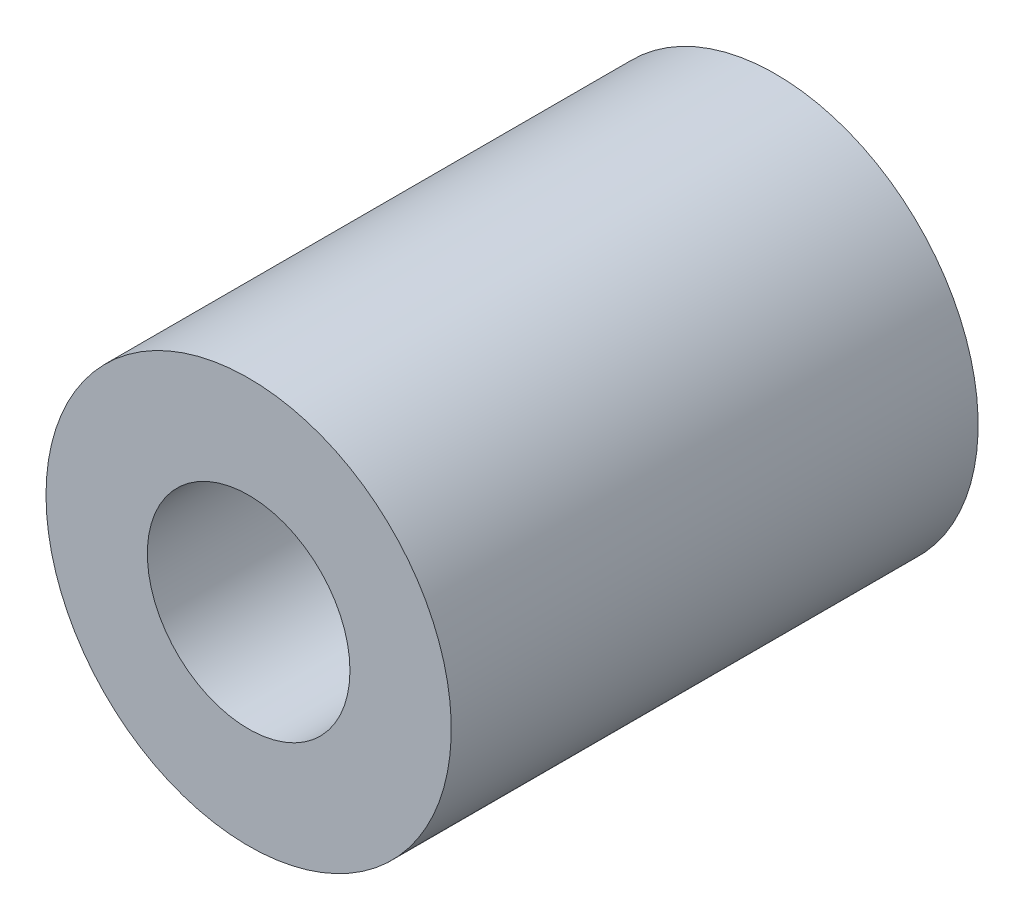
ISO-10303-21;
HEADER;
FILE_DESCRIPTION(('STEP AP214'),'2;1');
FILE_NAME('part.step','',(''),(''),'','','');
FILE_SCHEMA(('AUTOMOTIVE_DESIGN { 1 0 10303 214 1 1 1 1 }'));
ENDSEC;
DATA;
#1=APPLICATION_CONTEXT('core data for automotive mechanical design processes');
#2=APPLICATION_PROTOCOL_DEFINITION('international standard','automotive_design',2000,#1);
#3=PRODUCT_CONTEXT('',#1,'mechanical');
#4=PRODUCT('Part','Part','',(#3));
#5=PRODUCT_RELATED_PRODUCT_CATEGORY('part','',(#4));
#6=PRODUCT_DEFINITION_FORMATION('','',#4);
#7=PRODUCT_DEFINITION_CONTEXT('part definition',#1,'design');
#8=PRODUCT_DEFINITION('design','',#6,#7);
#9=PRODUCT_DEFINITION_SHAPE('','',#8);
#10=(LENGTH_UNIT() NAMED_UNIT(*) SI_UNIT(.MILLI.,.METRE.));
#11=(NAMED_UNIT(*) PLANE_ANGLE_UNIT() SI_UNIT($,.RADIAN.));
#12=(NAMED_UNIT(*) SI_UNIT($,.STERADIAN.) SOLID_ANGLE_UNIT());
#13=UNCERTAINTY_MEASURE_WITH_UNIT(LENGTH_MEASURE(1.E-05),#10,'distance_accuracy_value','');
#14=(GEOMETRIC_REPRESENTATION_CONTEXT(3) GLOBAL_UNCERTAINTY_ASSIGNED_CONTEXT((#13)) GLOBAL_UNIT_ASSIGNED_CONTEXT((#10,
#11,#12)) REPRESENTATION_CONTEXT('',''));
#15=CARTESIAN_POINT('',(0.,0.,0.));
#16=DIRECTION('',(0.,0.,1.));
#17=DIRECTION('',(1.,0.,0.));
#18=AXIS2_PLACEMENT_3D('',#15,#16,#17);
#19=CARTESIAN_POINT('',(0.,0.,26.));
#20=DIRECTION('',(0.,0.,-1.));
#21=DIRECTION('',(-1.,0.,0.));
#22=AXIS2_PLACEMENT_3D('',#19,#20,#21);
#23=CYLINDRICAL_SURFACE('',#22,10.);
#24=CARTESIAN_POINT('',(0.,0.,26.));
#25=DIRECTION('',(0.,0.,1.));
#26=DIRECTION('',(1.,0.,0.));
#27=AXIS2_PLACEMENT_3D('',#24,#25,#26);
#28=CIRCLE('',#27,10.);
#29=CARTESIAN_POINT('',(-10.,0.,26.));
#30=VERTEX_POINT('',#29);
#31=EDGE_CURVE('E10',#30,#30,#28,.T.);
#32=CARTESIAN_POINT('',(0.,0.,0.));
#33=DIRECTION('',(0.,0.,1.));
#34=DIRECTION('',(1.,0.,0.));
#35=AXIS2_PLACEMENT_3D('',#32,#33,#34);
#36=CIRCLE('',#35,10.);
#37=CARTESIAN_POINT('',(-10.,0.,0.));
#38=VERTEX_POINT('',#37);
#39=EDGE_CURVE('E34',#38,#38,#36,.T.);
#40=CARTESIAN_POINT('',(-10.,0.,26.));
#41=CARTESIAN_POINT('',(-10.,0.,25.7291666666667));
#42=CARTESIAN_POINT('',(-10.,0.,25.4583333333333));
#43=CARTESIAN_POINT('',(-10.,0.,24.9166666666667));
#44=CARTESIAN_POINT('',(-10.,0.,24.6458333333333));
#45=CARTESIAN_POINT('',(-10.,0.,24.1041666666667));
#46=CARTESIAN_POINT('',(-10.,0.,23.8333333333333));
#47=CARTESIAN_POINT('',(-10.,0.,23.2916666666667));
#48=CARTESIAN_POINT('',(-10.,0.,23.0208333333333));
#49=CARTESIAN_POINT('',(-10.,0.,22.4791666666667));
#50=CARTESIAN_POINT('',(-10.,0.,22.2083333333333));
#51=CARTESIAN_POINT('',(-10.,0.,21.6666666666667));
#52=CARTESIAN_POINT('',(-10.,0.,21.3958333333333));
#53=CARTESIAN_POINT('',(-10.,0.,20.8541666666667));
#54=CARTESIAN_POINT('',(-10.,0.,20.5833333333333));
#55=CARTESIAN_POINT('',(-10.,0.,20.0416666666667));
#56=CARTESIAN_POINT('',(-10.,0.,19.7708333333333));
#57=CARTESIAN_POINT('',(-10.,0.,19.2291666666667));
#58=CARTESIAN_POINT('',(-10.,0.,18.9583333333333));
#59=CARTESIAN_POINT('',(-10.,0.,18.4166666666667));
#60=CARTESIAN_POINT('',(-10.,0.,18.1458333333333));
#61=CARTESIAN_POINT('',(-10.,0.,17.6041666666667));
#62=CARTESIAN_POINT('',(-10.,0.,17.3333333333333));
#63=CARTESIAN_POINT('',(-10.,0.,16.7916666666667));
#64=CARTESIAN_POINT('',(-10.,0.,16.5208333333333));
#65=CARTESIAN_POINT('',(-10.,0.,15.9791666666667));
#66=CARTESIAN_POINT('',(-10.,0.,15.7083333333333));
#67=CARTESIAN_POINT('',(-10.,0.,15.1666666666667));
#68=CARTESIAN_POINT('',(-10.,0.,14.8958333333333));
#69=CARTESIAN_POINT('',(-10.,0.,14.3541666666667));
#70=CARTESIAN_POINT('',(-10.,0.,14.0833333333333));
#71=CARTESIAN_POINT('',(-10.,0.,13.5416666666667));
#72=CARTESIAN_POINT('',(-10.,0.,13.2708333333333));
#73=CARTESIAN_POINT('',(-10.,0.,12.7291666666667));
#74=CARTESIAN_POINT('',(-10.,0.,12.4583333333333));
#75=CARTESIAN_POINT('',(-10.,0.,11.9166666666667));
#76=CARTESIAN_POINT('',(-10.,0.,11.6458333333333));
#77=CARTESIAN_POINT('',(-10.,0.,11.1041666666667));
#78=CARTESIAN_POINT('',(-10.,0.,10.8333333333333));
#79=CARTESIAN_POINT('',(-10.,0.,10.2916666666667));
#80=CARTESIAN_POINT('',(-10.,0.,10.0208333333333));
#81=CARTESIAN_POINT('',(-10.,0.,9.47916666666667));
#82=CARTESIAN_POINT('',(-10.,0.,9.20833333333333));
#83=CARTESIAN_POINT('',(-10.,0.,8.66666666666667));
#84=CARTESIAN_POINT('',(-10.,0.,8.39583333333333));
#85=CARTESIAN_POINT('',(-10.,0.,7.85416666666667));
#86=CARTESIAN_POINT('',(-10.,0.,7.58333333333333));
#87=CARTESIAN_POINT('',(-10.,0.,7.04166666666667));
#88=CARTESIAN_POINT('',(-10.,0.,6.77083333333333));
#89=CARTESIAN_POINT('',(-10.,0.,6.22916666666667));
#90=CARTESIAN_POINT('',(-10.,0.,5.95833333333333));
#91=CARTESIAN_POINT('',(-10.,0.,5.41666666666667));
#92=CARTESIAN_POINT('',(-10.,0.,5.14583333333333));
#93=CARTESIAN_POINT('',(-10.,0.,4.60416666666667));
#94=CARTESIAN_POINT('',(-10.,0.,4.33333333333333));
#95=CARTESIAN_POINT('',(-10.,0.,3.79166666666667));
#96=CARTESIAN_POINT('',(-10.,0.,3.52083333333333));
#97=CARTESIAN_POINT('',(-10.,0.,2.97916666666667));
#98=CARTESIAN_POINT('',(-10.,0.,2.70833333333333));
#99=CARTESIAN_POINT('',(-10.,0.,2.16666666666667));
#100=CARTESIAN_POINT('',(-10.,0.,1.89583333333333));
#101=CARTESIAN_POINT('',(-10.,0.,1.35416666666667));
#102=CARTESIAN_POINT('',(-10.,0.,1.08333333333333));
#103=CARTESIAN_POINT('',(-10.,0.,0.541666666666667));
#104=CARTESIAN_POINT('',(-10.,0.,0.270833333333334));
#105=CARTESIAN_POINT('',(-10.,0.,0.));
#106=B_SPLINE_CURVE_WITH_KNOTS('',3,(#40,#41,#42,#43,#44,#45,#46,#47,#48,#49,#50,#51,#52,#53,
#54,#55,#56,#57,#58,#59,#60,#61,#62,#63,#64,#65,#66,#67,#68,#69,#70,#71,#72,#73,#74,#75,#76,#77,
#78,#79,#80,#81,#82,#83,#84,#85,#86,#87,#88,#89,#90,#91,#92,#93,#94,#95,#96,#97,#98,#99,#100,
#101,#102,#103,#104,#105),.UNSPECIFIED.,.F.,.F.,(4,2,2,2,2,2,2,2,2,2,2,2,2,2,2,2,2,2,2,2,2,2,2,
2,2,2,2,2,2,2,2,2,4),(0.,0.812499999999997,1.625,2.4375,3.25,4.0625,4.875,5.6875,6.5,7.3125,
8.125,8.93749999999999,9.74999999999999,10.5625,11.375,12.1875,13.,13.8125,14.625,15.4375,16.25,
17.0625,17.875,18.6875,19.5,20.3125,21.125,21.9375,22.75,23.5625,24.375,25.1875,26.),.UNSPECIFIED.);
#107=EDGE_CURVE('BSEAM31',#30,#38,#106,.T.);
#108=ORIENTED_EDGE('',*,*,#31,.F.);
#109=ORIENTED_EDGE('',*,*,#39,.T.);
#110=ORIENTED_EDGE('',*,*,#107,.T.);
#111=ORIENTED_EDGE('',*,*,#107,.F.);
#112=EDGE_LOOP('',(#108,#110,#109,#111));
#113=FACE_BOUND('',#112,.T.);
#114=ADVANCED_FACE('F31',(#113),#23,.T.);
#115=CARTESIAN_POINT('',(0.,0.,26.));
#116=DIRECTION('',(0.,0.,1.));
#117=DIRECTION('',(1.,0.,0.));
#118=AXIS2_PLACEMENT_3D('',#115,#116,#117);
#119=PLANE('',#118);
#120=CARTESIAN_POINT('',(0.,0.,26.));
#121=DIRECTION('',(0.,0.,1.));
#122=DIRECTION('',(1.,0.,0.));
#123=AXIS2_PLACEMENT_3D('',#120,#121,#122);
#124=CIRCLE('',#123,5.);
#125=CARTESIAN_POINT('',(5.,0.,26.));
#126=VERTEX_POINT('',#125);
#127=EDGE_CURVE('E43',#126,#126,#124,.T.);
#128=ORIENTED_EDGE('',*,*,#127,.F.);
#129=EDGE_LOOP('',(#128));
#130=FACE_BOUND('',#129,.T.);
#131=ORIENTED_EDGE('',*,*,#31,.T.);
#132=EDGE_LOOP('',(#131));
#133=FACE_BOUND('',#132,.T.);
#134=ADVANCED_FACE('F68',(#130,#133),#119,.T.);
#135=CARTESIAN_POINT('',(0.,0.,0.));
#136=DIRECTION('',(0.,0.,1.));
#137=DIRECTION('',(1.,0.,0.));
#138=AXIS2_PLACEMENT_3D('',#135,#136,#137);
#139=PLANE('',#138);
#140=CARTESIAN_POINT('',(0.,0.,0.));
#141=DIRECTION('',(0.,0.,-1.));
#142=DIRECTION('',(-1.,0.,0.));
#143=AXIS2_PLACEMENT_3D('',#140,#141,#142);
#144=CIRCLE('',#143,2.);
#145=CARTESIAN_POINT('',(-2.,0.,0.));
#146=VERTEX_POINT('',#145);
#147=EDGE_CURVE('E49',#146,#146,#144,.T.);
#148=ORIENTED_EDGE('',*,*,#147,.F.);
#149=EDGE_LOOP('',(#148));
#150=FACE_BOUND('',#149,.T.);
#151=ORIENTED_EDGE('',*,*,#39,.F.);
#152=EDGE_LOOP('',(#151));
#153=FACE_BOUND('',#152,.T.);
#154=ADVANCED_FACE('F64',(#150,#153),#139,.F.);
#155=CARTESIAN_POINT('',(0.,0.,18.));
#156=DIRECTION('',(0.,0.,1.));
#157=DIRECTION('',(1.,0.,0.));
#158=AXIS2_PLACEMENT_3D('',#155,#156,#157);
#159=CYLINDRICAL_SURFACE('',#158,5.);
#160=CARTESIAN_POINT('',(0.,0.,18.));
#161=DIRECTION('',(0.,0.,1.));
#162=DIRECTION('',(1.,0.,0.));
#163=AXIS2_PLACEMENT_3D('',#160,#161,#162);
#164=CIRCLE('',#163,5.);
#165=CARTESIAN_POINT('',(5.,0.,18.));
#166=VERTEX_POINT('',#165);
#167=EDGE_CURVE('E41',#166,#166,#164,.T.);
#168=ORIENTED_EDGE('',*,*,#167,.F.);
#169=EDGE_LOOP('',(#168));
#170=FACE_BOUND('',#169,.T.);
#171=ORIENTED_EDGE('',*,*,#127,.T.);
#172=EDGE_LOOP('',(#171));
#173=FACE_BOUND('',#172,.T.);
#174=ADVANCED_FACE('F67',(#170,#173),#159,.F.);
#175=CARTESIAN_POINT('',(0.,0.,18.));
#176=DIRECTION('',(0.,0.,1.));
#177=DIRECTION('',(1.,0.,0.));
#178=AXIS2_PLACEMENT_3D('',#175,#176,#177);
#179=PLANE('',#178);
#180=ORIENTED_EDGE('',*,*,#167,.T.);
#181=EDGE_LOOP('',(#180));
#182=FACE_BOUND('',#181,.T.);
#183=ADVANCED_FACE('F60',(#182),#179,.T.);
#184=CARTESIAN_POINT('',(0.,0.,8.));
#185=DIRECTION('',(0.,0.,-1.));
#186=DIRECTION('',(-1.,0.,0.));
#187=AXIS2_PLACEMENT_3D('',#184,#185,#186);
#188=CYLINDRICAL_SURFACE('',#187,2.);
#189=CARTESIAN_POINT('',(0.,0.,8.));
#190=DIRECTION('',(0.,0.,-1.));
#191=DIRECTION('',(-1.,0.,0.));
#192=AXIS2_PLACEMENT_3D('',#189,#190,#191);
#193=CIRCLE('',#192,2.);
#194=CARTESIAN_POINT('',(-2.,0.,8.));
#195=VERTEX_POINT('',#194);
#196=EDGE_CURVE('E46',#195,#195,#193,.T.);
#197=ORIENTED_EDGE('',*,*,#196,.F.);
#198=EDGE_LOOP('',(#197));
#199=FACE_BOUND('',#198,.T.);
#200=ORIENTED_EDGE('',*,*,#147,.T.);
#201=EDGE_LOOP('',(#200));
#202=FACE_BOUND('',#201,.T.);
#203=ADVANCED_FACE('F57',(#199,#202),#188,.F.);
#204=CARTESIAN_POINT('',(0.,0.,8.));
#205=DIRECTION('',(0.,0.,-1.));
#206=DIRECTION('',(-1.,0.,0.));
#207=AXIS2_PLACEMENT_3D('',#204,#205,#206);
#208=PLANE('',#207);
#209=ORIENTED_EDGE('',*,*,#196,.T.);
#210=EDGE_LOOP('',(#209));
#211=FACE_BOUND('',#210,.T.);
#212=ADVANCED_FACE('F55',(#211),#208,.T.);
#213=CLOSED_SHELL('',(#114,#134,#154,#174,#183,#203,#212));
#214=MANIFOLD_SOLID_BREP('B2',#213);
#215=ADVANCED_BREP_SHAPE_REPRESENTATION('',(#18,#214),#14);
#216=SHAPE_DEFINITION_REPRESENTATION(#9,#215);
ENDSEC;
END-ISO-10303-21;
